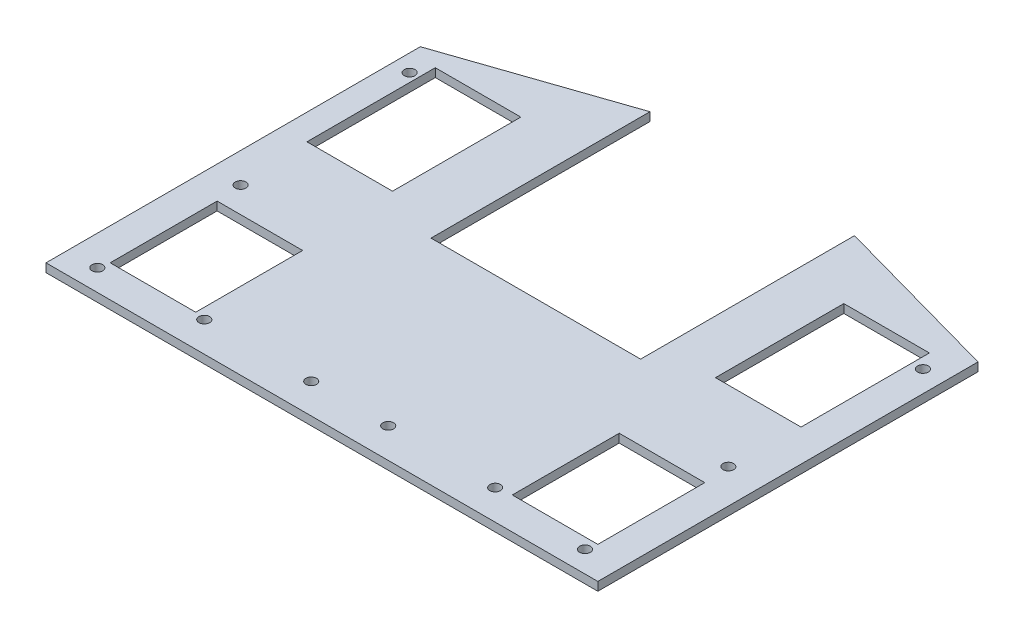
ISO-10303-21;
HEADER;
FILE_DESCRIPTION(('STEP AP214'),'2;1');
FILE_NAME('part.step','',(''),(''),'','','');
FILE_SCHEMA(('AUTOMOTIVE_DESIGN { 1 0 10303 214 1 1 1 1 }'));
ENDSEC;
DATA;
#1=APPLICATION_CONTEXT('core data for automotive mechanical design processes');
#2=APPLICATION_PROTOCOL_DEFINITION('international standard','automotive_design',2000,#1);
#3=PRODUCT_CONTEXT('',#1,'mechanical');
#4=PRODUCT('Part','Part','',(#3));
#5=PRODUCT_RELATED_PRODUCT_CATEGORY('part','',(#4));
#6=PRODUCT_DEFINITION_FORMATION('','',#4);
#7=PRODUCT_DEFINITION_CONTEXT('part definition',#1,'design');
#8=PRODUCT_DEFINITION('design','',#6,#7);
#9=PRODUCT_DEFINITION_SHAPE('','',#8);
#10=(LENGTH_UNIT() NAMED_UNIT(*) SI_UNIT(.MILLI.,.METRE.));
#11=(NAMED_UNIT(*) PLANE_ANGLE_UNIT() SI_UNIT($,.RADIAN.));
#12=(NAMED_UNIT(*) SI_UNIT($,.STERADIAN.) SOLID_ANGLE_UNIT());
#13=UNCERTAINTY_MEASURE_WITH_UNIT(LENGTH_MEASURE(1.E-05),#10,'distance_accuracy_value','');
#14=(GEOMETRIC_REPRESENTATION_CONTEXT(3) GLOBAL_UNCERTAINTY_ASSIGNED_CONTEXT((#13)) GLOBAL_UNIT_ASSIGNED_CONTEXT((#10,
#11,#12)) REPRESENTATION_CONTEXT('',''));
#15=CARTESIAN_POINT('',(0.,0.,0.));
#16=DIRECTION('',(0.,0.,1.));
#17=DIRECTION('',(1.,0.,0.));
#18=AXIS2_PLACEMENT_3D('',#15,#16,#17);
#19=CARTESIAN_POINT('',(0.,4.,0.));
#20=DIRECTION('',(0.,-1.,0.));
#21=DIRECTION('',(0.,0.,-1.));
#22=AXIS2_PLACEMENT_3D('',#19,#20,#21);
#23=PLANE('',#22);
#24=DIRECTION('',(0.,0.,1.));
#25=VECTOR('',#24,1.);
#26=CARTESIAN_POINT('',(-116.,4.,-9.99999999999999));
#27=LINE('',#26,#25);
#28=CARTESIAN_POINT('',(-116.,4.,-70.));
#29=VERTEX_POINT('',#28);
#30=CARTESIAN_POINT('',(-116.,4.,-9.99999999999999));
#31=VERTEX_POINT('',#30);
#32=EDGE_CURVE('E234',#29,#31,#27,.T.);
#33=ORIENTED_EDGE('',*,*,#32,.F.);
#34=DIRECTION('',(-1.,0.,0.));
#35=VECTOR('',#34,1.);
#36=CARTESIAN_POINT('',(-116.,4.,-70.));
#37=LINE('',#36,#35);
#38=CARTESIAN_POINT('',(-76.,4.,-70.));
#39=VERTEX_POINT('',#38);
#40=EDGE_CURVE('E242',#39,#29,#37,.T.);
#41=ORIENTED_EDGE('',*,*,#40,.F.);
#42=DIRECTION('',(0.,0.,-1.));
#43=VECTOR('',#42,1.);
#44=CARTESIAN_POINT('',(-76.,4.,-9.99999999999999));
#45=LINE('',#44,#43);
#46=CARTESIAN_POINT('',(-76.,4.,-9.99999999999999));
#47=VERTEX_POINT('',#46);
#48=EDGE_CURVE('E239',#47,#39,#45,.T.);
#49=ORIENTED_EDGE('',*,*,#48,.F.);
#50=DIRECTION('',(1.,0.,0.));
#51=VECTOR('',#50,1.);
#52=CARTESIAN_POINT('',(-116.,4.,-9.99999999999999));
#53=LINE('',#52,#51);
#54=EDGE_CURVE('E236',#31,#47,#53,.T.);
#55=ORIENTED_EDGE('',*,*,#54,.F.);
#56=EDGE_LOOP('',(#33,#41,#49,#55));
#57=FACE_BOUND('',#56,.T.);
#58=DIRECTION('',(0.,0.,1.));
#59=VECTOR('',#58,1.);
#60=CARTESIAN_POINT('',(75.,4.,85.));
#61=LINE('',#60,#59);
#62=CARTESIAN_POINT('',(75.,4.,35.));
#63=VERTEX_POINT('',#62);
#64=CARTESIAN_POINT('',(75.,4.,85.));
#65=VERTEX_POINT('',#64);
#66=EDGE_CURVE('E296',#63,#65,#61,.T.);
#67=ORIENTED_EDGE('',*,*,#66,.F.);
#68=DIRECTION('',(-1.,0.,0.));
#69=VECTOR('',#68,1.);
#70=CARTESIAN_POINT('',(75.,4.,35.));
#71=LINE('',#70,#69);
#72=CARTESIAN_POINT('',(115.,4.,35.));
#73=VERTEX_POINT('',#72);
#74=EDGE_CURVE('E304',#73,#63,#71,.T.);
#75=ORIENTED_EDGE('',*,*,#74,.F.);
#76=DIRECTION('',(0.,0.,-1.));
#77=VECTOR('',#76,1.);
#78=CARTESIAN_POINT('',(115.,4.,85.));
#79=LINE('',#78,#77);
#80=CARTESIAN_POINT('',(115.,4.,85.));
#81=VERTEX_POINT('',#80);
#82=EDGE_CURVE('E301',#81,#73,#79,.T.);
#83=ORIENTED_EDGE('',*,*,#82,.F.);
#84=DIRECTION('',(1.,0.,0.));
#85=VECTOR('',#84,1.);
#86=CARTESIAN_POINT('',(75.,4.,85.));
#87=LINE('',#86,#85);
#88=EDGE_CURVE('E298',#65,#81,#87,.T.);
#89=ORIENTED_EDGE('',*,*,#88,.F.);
#90=EDGE_LOOP('',(#67,#75,#83,#89));
#91=FACE_BOUND('',#90,.T.);
#92=DIRECTION('',(0.,0.,1.));
#93=VECTOR('',#92,1.);
#94=CARTESIAN_POINT('',(-128.,4.,100.));
#95=LINE('',#94,#93);
#96=CARTESIAN_POINT('',(-128.,4.,-75.));
#97=VERTEX_POINT('',#96);
#98=CARTESIAN_POINT('',(-128.,4.,100.));
#99=VERTEX_POINT('',#98);
#100=EDGE_CURVE('E327',#97,#99,#95,.T.);
#101=ORIENTED_EDGE('',*,*,#100,.T.);
#102=DIRECTION('',(1.,0.,0.));
#103=VECTOR('',#102,1.);
#104=CARTESIAN_POINT('',(-128.,4.,100.));
#105=LINE('',#104,#103);
#106=CARTESIAN_POINT('',(130.,4.,100.));
#107=VERTEX_POINT('',#106);
#108=EDGE_CURVE('E330',#99,#107,#105,.T.);
#109=ORIENTED_EDGE('',*,*,#108,.T.);
#110=DIRECTION('',(0.,0.,-1.));
#111=VECTOR('',#110,1.);
#112=CARTESIAN_POINT('',(130.,4.,100.));
#113=LINE('',#112,#111);
#114=CARTESIAN_POINT('',(130.,4.,-77.7383490664101));
#115=VERTEX_POINT('',#114);
#116=EDGE_CURVE('E333',#107,#115,#113,.T.);
#117=ORIENTED_EDGE('',*,*,#116,.T.);
#118=DIRECTION('',(-0.963395362901552,0.,-0.268084640999418));
#119=VECTOR('',#118,1.);
#120=CARTESIAN_POINT('',(130.,4.,-77.7383490664101));
#121=LINE('',#120,#119);
#122=CARTESIAN_POINT('',(50.,4.,-100.));
#123=VERTEX_POINT('',#122);
#124=EDGE_CURVE('E335',#115,#123,#121,.T.);
#125=ORIENTED_EDGE('',*,*,#124,.T.);
#126=DIRECTION('',(0.,0.,1.));
#127=VECTOR('',#126,1.);
#128=CARTESIAN_POINT('',(50.,4.,0.));
#129=LINE('',#128,#127);
#130=CARTESIAN_POINT('',(50.,4.,0.));
#131=VERTEX_POINT('',#130);
#132=EDGE_CURVE('E337',#123,#131,#129,.T.);
#133=ORIENTED_EDGE('',*,*,#132,.T.);
#134=DIRECTION('',(-1.,0.,0.));
#135=VECTOR('',#134,1.);
#136=CARTESIAN_POINT('',(-48.,4.,0.));
#137=LINE('',#136,#135);
#138=CARTESIAN_POINT('',(-48.,4.,0.));
#139=VERTEX_POINT('',#138);
#140=EDGE_CURVE('E339',#131,#139,#137,.T.);
#141=ORIENTED_EDGE('',*,*,#140,.T.);
#142=DIRECTION('',(0.,0.,-1.));
#143=VECTOR('',#142,1.);
#144=CARTESIAN_POINT('',(-48.,4.,-102.368421052632));
#145=LINE('',#144,#143);
#146=CARTESIAN_POINT('',(-48.,4.,-102.368421052632));
#147=VERTEX_POINT('',#146);
#148=EDGE_CURVE('E341',#139,#147,#145,.T.);
#149=ORIENTED_EDGE('',*,*,#148,.T.);
#150=DIRECTION('',(-0.946163984953356,0.,0.32368767906299));
#151=VECTOR('',#150,1.);
#152=CARTESIAN_POINT('',(-128.,4.,-75.));
#153=LINE('',#152,#151);
#154=EDGE_CURVE('E343',#147,#97,#153,.T.);
#155=ORIENTED_EDGE('',*,*,#154,.T.);
#156=EDGE_LOOP('',(#101,#109,#117,#125,#133,#141,#149,#155));
#157=FACE_BOUND('',#156,.T.);
#158=DIRECTION('',(0.,0.,1.));
#159=VECTOR('',#158,1.);
#160=CARTESIAN_POINT('',(75.,4.,-9.99999999999999));
#161=LINE('',#160,#159);
#162=CARTESIAN_POINT('',(75.,4.,-70.));
#163=VERTEX_POINT('',#162);
#164=CARTESIAN_POINT('',(75.,4.,-9.99999999999999));
#165=VERTEX_POINT('',#164);
#166=EDGE_CURVE('E265',#163,#165,#161,.T.);
#167=ORIENTED_EDGE('',*,*,#166,.F.);
#168=DIRECTION('',(-1.,0.,0.));
#169=VECTOR('',#168,1.);
#170=CARTESIAN_POINT('',(75.,4.,-70.));
#171=LINE('',#170,#169);
#172=CARTESIAN_POINT('',(115.,4.,-70.));
#173=VERTEX_POINT('',#172);
#174=EDGE_CURVE('E273',#173,#163,#171,.T.);
#175=ORIENTED_EDGE('',*,*,#174,.F.);
#176=DIRECTION('',(0.,0.,-1.));
#177=VECTOR('',#176,1.);
#178=CARTESIAN_POINT('',(115.,4.,-9.99999999999999));
#179=LINE('',#178,#177);
#180=CARTESIAN_POINT('',(115.,4.,-9.99999999999999));
#181=VERTEX_POINT('',#180);
#182=EDGE_CURVE('E270',#181,#173,#179,.T.);
#183=ORIENTED_EDGE('',*,*,#182,.F.);
#184=DIRECTION('',(1.,0.,0.));
#185=VECTOR('',#184,1.);
#186=CARTESIAN_POINT('',(75.,4.,-9.99999999999999));
#187=LINE('',#186,#185);
#188=EDGE_CURVE('E267',#165,#181,#187,.T.);
#189=ORIENTED_EDGE('',*,*,#188,.F.);
#190=EDGE_LOOP('',(#167,#175,#183,#189));
#191=FACE_BOUND('',#190,.T.);
#192=DIRECTION('',(0.,0.,1.));
#193=VECTOR('',#192,1.);
#194=CARTESIAN_POINT('',(-113.,4.,85.));
#195=LINE('',#194,#193);
#196=CARTESIAN_POINT('',(-113.,4.,35.));
#197=VERTEX_POINT('',#196);
#198=CARTESIAN_POINT('',(-113.,4.,85.));
#199=VERTEX_POINT('',#198);
#200=EDGE_CURVE('E195',#197,#199,#195,.T.);
#201=ORIENTED_EDGE('',*,*,#200,.F.);
#202=DIRECTION('',(-1.,0.,0.));
#203=VECTOR('',#202,1.);
#204=CARTESIAN_POINT('',(-113.,4.,35.));
#205=LINE('',#204,#203);
#206=CARTESIAN_POINT('',(-73.,4.,35.));
#207=VERTEX_POINT('',#206);
#208=EDGE_CURVE('E218',#207,#197,#205,.T.);
#209=ORIENTED_EDGE('',*,*,#208,.F.);
#210=DIRECTION('',(0.,0.,-1.));
#211=VECTOR('',#210,1.);
#212=CARTESIAN_POINT('',(-73.,4.,85.));
#213=LINE('',#212,#211);
#214=CARTESIAN_POINT('',(-73.,4.,85.));
#215=VERTEX_POINT('',#214);
#216=EDGE_CURVE('E216',#215,#207,#213,.T.);
#217=ORIENTED_EDGE('',*,*,#216,.F.);
#218=DIRECTION('',(1.,0.,0.));
#219=VECTOR('',#218,1.);
#220=CARTESIAN_POINT('',(-113.,4.,85.));
#221=LINE('',#220,#219);
#222=EDGE_CURVE('E203',#199,#215,#221,.T.);
#223=ORIENTED_EDGE('',*,*,#222,.F.);
#224=EDGE_LOOP('',(#201,#209,#217,#223));
#225=FACE_BOUND('',#224,.T.);
#226=CARTESIAN_POINT('',(-114.,4.,90.));
#227=DIRECTION('',(0.,1.,0.));
#228=DIRECTION('',(0.,0.,1.));
#229=AXIS2_PLACEMENT_3D('',#226,#227,#228);
#230=CIRCLE('',#229,2.50000000000001);
#231=CARTESIAN_POINT('',(-114.,4.,92.5));
#232=VERTEX_POINT('',#231);
#233=EDGE_CURVE('E224',#232,#232,#230,.T.);
#234=ORIENTED_EDGE('',*,*,#233,.F.);
#235=EDGE_LOOP('',(#234));
#236=FACE_BOUND('',#235,.T.);
#237=CARTESIAN_POINT('',(-68.,4.,86.));
#238=DIRECTION('',(0.,1.,0.));
#239=DIRECTION('',(0.,0.,1.));
#240=AXIS2_PLACEMENT_3D('',#237,#238,#239);
#241=CIRCLE('',#240,2.5);
#242=CARTESIAN_POINT('',(-68.,4.,88.5));
#243=VERTEX_POINT('',#242);
#244=EDGE_CURVE('E611',#243,#243,#241,.T.);
#245=ORIENTED_EDGE('',*,*,#244,.F.);
#246=EDGE_LOOP('',(#245));
#247=FACE_BOUND('',#246,.T.);
#248=CARTESIAN_POINT('',(-18.,4.,86.));
#249=DIRECTION('',(0.,1.,0.));
#250=DIRECTION('',(0.,0.,1.));
#251=AXIS2_PLACEMENT_3D('',#248,#249,#250);
#252=CIRCLE('',#251,2.5);
#253=CARTESIAN_POINT('',(-18.,4.,88.5));
#254=VERTEX_POINT('',#253);
#255=EDGE_CURVE('E605',#254,#254,#252,.T.);
#256=ORIENTED_EDGE('',*,*,#255,.F.);
#257=EDGE_LOOP('',(#256));
#258=FACE_BOUND('',#257,.T.);
#259=CARTESIAN_POINT('',(-120.,4.,-62.));
#260=DIRECTION('',(0.,1.,0.));
#261=DIRECTION('',(0.,0.,1.));
#262=AXIS2_PLACEMENT_3D('',#259,#260,#261);
#263=CIRCLE('',#262,2.5);
#264=CARTESIAN_POINT('',(-120.,4.,-59.5));
#265=VERTEX_POINT('',#264);
#266=EDGE_CURVE('E599',#265,#265,#263,.T.);
#267=ORIENTED_EDGE('',*,*,#266,.F.);
#268=EDGE_LOOP('',(#267));
#269=FACE_BOUND('',#268,.T.);
#270=CARTESIAN_POINT('',(-114.,4.,23.));
#271=DIRECTION('',(0.,1.,0.));
#272=DIRECTION('',(0.,0.,1.));
#273=AXIS2_PLACEMENT_3D('',#270,#271,#272);
#274=CIRCLE('',#273,2.50000000000001);
#275=CARTESIAN_POINT('',(-114.,4.,25.5));
#276=VERTEX_POINT('',#275);
#277=EDGE_CURVE('E593',#276,#276,#274,.T.);
#278=ORIENTED_EDGE('',*,*,#277,.F.);
#279=EDGE_LOOP('',(#278));
#280=FACE_BOUND('',#279,.T.);
#281=CARTESIAN_POINT('',(18.,4.,86.));
#282=DIRECTION('',(0.,1.,0.));
#283=DIRECTION('',(0.,0.,-1.));
#284=AXIS2_PLACEMENT_3D('',#281,#282,#283);
#285=CIRCLE('',#284,2.5);
#286=CARTESIAN_POINT('',(18.,4.,83.5));
#287=VERTEX_POINT('',#286);
#288=EDGE_CURVE('E587',#287,#287,#285,.T.);
#289=ORIENTED_EDGE('',*,*,#288,.F.);
#290=EDGE_LOOP('',(#289));
#291=FACE_BOUND('',#290,.T.);
#292=CARTESIAN_POINT('',(68.,4.,86.));
#293=DIRECTION('',(0.,1.,0.));
#294=DIRECTION('',(0.,0.,-1.));
#295=AXIS2_PLACEMENT_3D('',#292,#293,#294);
#296=CIRCLE('',#295,2.5);
#297=CARTESIAN_POINT('',(68.,4.,83.5));
#298=VERTEX_POINT('',#297);
#299=EDGE_CURVE('E581',#298,#298,#296,.T.);
#300=ORIENTED_EDGE('',*,*,#299,.F.);
#301=EDGE_LOOP('',(#300));
#302=FACE_BOUND('',#301,.T.);
#303=CARTESIAN_POINT('',(114.,4.,90.));
#304=DIRECTION('',(0.,1.,0.));
#305=DIRECTION('',(0.,0.,-1.));
#306=AXIS2_PLACEMENT_3D('',#303,#304,#305);
#307=CIRCLE('',#306,2.50000000000001);
#308=CARTESIAN_POINT('',(114.,4.,87.5));
#309=VERTEX_POINT('',#308);
#310=EDGE_CURVE('E575',#309,#309,#307,.T.);
#311=ORIENTED_EDGE('',*,*,#310,.F.);
#312=EDGE_LOOP('',(#311));
#313=FACE_BOUND('',#312,.T.);
#314=CARTESIAN_POINT('',(114.,4.,23.));
#315=DIRECTION('',(0.,1.,0.));
#316=DIRECTION('',(0.,0.,-1.));
#317=AXIS2_PLACEMENT_3D('',#314,#315,#316);
#318=CIRCLE('',#317,2.50000000000001);
#319=CARTESIAN_POINT('',(114.,4.,20.5));
#320=VERTEX_POINT('',#319);
#321=EDGE_CURVE('E569',#320,#320,#318,.T.);
#322=ORIENTED_EDGE('',*,*,#321,.F.);
#323=EDGE_LOOP('',(#322));
#324=FACE_BOUND('',#323,.T.);
#325=CARTESIAN_POINT('',(120.,4.,-62.));
#326=DIRECTION('',(0.,1.,0.));
#327=DIRECTION('',(0.,0.,-1.));
#328=AXIS2_PLACEMENT_3D('',#325,#326,#327);
#329=CIRCLE('',#328,2.5);
#330=CARTESIAN_POINT('',(120.,4.,-64.5));
#331=VERTEX_POINT('',#330);
#332=EDGE_CURVE('E560',#331,#331,#329,.T.);
#333=ORIENTED_EDGE('',*,*,#332,.F.);
#334=EDGE_LOOP('',(#333));
#335=FACE_BOUND('',#334,.T.);
#336=ADVANCED_FACE('F34',(#57,#91,#157,#191,#225,#236,#247,#258,#269,#280,#291,#302,#313,#324,
#335),#23,.F.);
#337=CARTESIAN_POINT('',(0.,0.,0.));
#338=DIRECTION('',(0.,-1.,0.));
#339=DIRECTION('',(0.,0.,-1.));
#340=AXIS2_PLACEMENT_3D('',#337,#338,#339);
#341=PLANE('',#340);
#342=CARTESIAN_POINT('',(114.,0.,23.));
#343=DIRECTION('',(0.,1.,0.));
#344=DIRECTION('',(0.,0.,-1.));
#345=AXIS2_PLACEMENT_3D('',#342,#343,#344);
#346=CIRCLE('',#345,2.50000000000001);
#347=CARTESIAN_POINT('',(114.,0.,20.5));
#348=VERTEX_POINT('',#347);
#349=EDGE_CURVE('E566',#348,#348,#346,.T.);
#350=ORIENTED_EDGE('',*,*,#349,.T.);
#351=EDGE_LOOP('',(#350));
#352=FACE_BOUND('',#351,.T.);
#353=CARTESIAN_POINT('',(68.,0.,86.));
#354=DIRECTION('',(0.,1.,0.));
#355=DIRECTION('',(0.,0.,-1.));
#356=AXIS2_PLACEMENT_3D('',#353,#354,#355);
#357=CIRCLE('',#356,2.5);
#358=CARTESIAN_POINT('',(68.,0.,83.5));
#359=VERTEX_POINT('',#358);
#360=EDGE_CURVE('E578',#359,#359,#357,.T.);
#361=ORIENTED_EDGE('',*,*,#360,.T.);
#362=EDGE_LOOP('',(#361));
#363=FACE_BOUND('',#362,.T.);
#364=CARTESIAN_POINT('',(-114.,0.,23.));
#365=DIRECTION('',(0.,1.,0.));
#366=DIRECTION('',(0.,0.,1.));
#367=AXIS2_PLACEMENT_3D('',#364,#365,#366);
#368=CIRCLE('',#367,2.50000000000001);
#369=CARTESIAN_POINT('',(-114.,0.,25.5));
#370=VERTEX_POINT('',#369);
#371=EDGE_CURVE('E590',#370,#370,#368,.T.);
#372=ORIENTED_EDGE('',*,*,#371,.T.);
#373=EDGE_LOOP('',(#372));
#374=FACE_BOUND('',#373,.T.);
#375=CARTESIAN_POINT('',(-18.,0.,86.));
#376=DIRECTION('',(0.,1.,0.));
#377=DIRECTION('',(0.,0.,1.));
#378=AXIS2_PLACEMENT_3D('',#375,#376,#377);
#379=CIRCLE('',#378,2.5);
#380=CARTESIAN_POINT('',(-18.,0.,88.5));
#381=VERTEX_POINT('',#380);
#382=EDGE_CURVE('E602',#381,#381,#379,.T.);
#383=ORIENTED_EDGE('',*,*,#382,.T.);
#384=EDGE_LOOP('',(#383));
#385=FACE_BOUND('',#384,.T.);
#386=CARTESIAN_POINT('',(-114.,0.,90.));
#387=DIRECTION('',(0.,1.,0.));
#388=DIRECTION('',(0.,0.,1.));
#389=AXIS2_PLACEMENT_3D('',#386,#387,#388);
#390=CIRCLE('',#389,2.50000000000001);
#391=CARTESIAN_POINT('',(-114.,0.,92.5));
#392=VERTEX_POINT('',#391);
#393=EDGE_CURVE('E614',#392,#392,#390,.T.);
#394=ORIENTED_EDGE('',*,*,#393,.T.);
#395=EDGE_LOOP('',(#394));
#396=FACE_BOUND('',#395,.T.);
#397=DIRECTION('',(0.,0.,1.));
#398=VECTOR('',#397,1.);
#399=CARTESIAN_POINT('',(-128.,0.,100.));
#400=LINE('',#399,#398);
#401=CARTESIAN_POINT('',(-128.,0.,-75.));
#402=VERTEX_POINT('',#401);
#403=CARTESIAN_POINT('',(-128.,0.,100.));
#404=VERTEX_POINT('',#403);
#405=EDGE_CURVE('E326',#402,#404,#400,.T.);
#406=ORIENTED_EDGE('',*,*,#405,.F.);
#407=DIRECTION('',(-0.946163984953356,0.,0.32368767906299));
#408=VECTOR('',#407,1.);
#409=CARTESIAN_POINT('',(-128.,0.,-75.));
#410=LINE('',#409,#408);
#411=CARTESIAN_POINT('',(-48.,0.,-102.368421052632));
#412=VERTEX_POINT('',#411);
#413=EDGE_CURVE('E331',#412,#402,#410,.T.);
#414=ORIENTED_EDGE('',*,*,#413,.F.);
#415=DIRECTION('',(0.,0.,-1.));
#416=VECTOR('',#415,1.);
#417=CARTESIAN_POINT('',(-48.,0.,-102.368421052632));
#418=LINE('',#417,#416);
#419=CARTESIAN_POINT('',(-48.,0.,0.));
#420=VERTEX_POINT('',#419);
#421=EDGE_CURVE('E358',#420,#412,#418,.T.);
#422=ORIENTED_EDGE('',*,*,#421,.F.);
#423=DIRECTION('',(-1.,0.,0.));
#424=VECTOR('',#423,1.);
#425=CARTESIAN_POINT('',(-48.,0.,0.));
#426=LINE('',#425,#424);
#427=CARTESIAN_POINT('',(50.,0.,0.));
#428=VERTEX_POINT('',#427);
#429=EDGE_CURVE('E356',#428,#420,#426,.T.);
#430=ORIENTED_EDGE('',*,*,#429,.F.);
#431=DIRECTION('',(0.,0.,1.));
#432=VECTOR('',#431,1.);
#433=CARTESIAN_POINT('',(50.,0.,0.));
#434=LINE('',#433,#432);
#435=CARTESIAN_POINT('',(50.,0.,-100.));
#436=VERTEX_POINT('',#435);
#437=EDGE_CURVE('E354',#436,#428,#434,.T.);
#438=ORIENTED_EDGE('',*,*,#437,.F.);
#439=DIRECTION('',(-0.963395362901552,0.,-0.268084640999418));
#440=VECTOR('',#439,1.);
#441=CARTESIAN_POINT('',(130.,0.,-77.7383490664101));
#442=LINE('',#441,#440);
#443=CARTESIAN_POINT('',(130.,0.,-77.7383490664101));
#444=VERTEX_POINT('',#443);
#445=EDGE_CURVE('E352',#444,#436,#442,.T.);
#446=ORIENTED_EDGE('',*,*,#445,.F.);
#447=DIRECTION('',(0.,0.,-1.));
#448=VECTOR('',#447,1.);
#449=CARTESIAN_POINT('',(130.,0.,100.));
#450=LINE('',#449,#448);
#451=CARTESIAN_POINT('',(130.,0.,100.));
#452=VERTEX_POINT('',#451);
#453=EDGE_CURVE('E350',#452,#444,#450,.T.);
#454=ORIENTED_EDGE('',*,*,#453,.F.);
#455=DIRECTION('',(1.,0.,0.));
#456=VECTOR('',#455,1.);
#457=CARTESIAN_POINT('',(-128.,0.,100.));
#458=LINE('',#457,#456);
#459=EDGE_CURVE('E348',#404,#452,#458,.T.);
#460=ORIENTED_EDGE('',*,*,#459,.F.);
#461=EDGE_LOOP('',(#406,#414,#422,#430,#438,#446,#454,#460));
#462=FACE_BOUND('',#461,.T.);
#463=DIRECTION('',(-1.,0.,0.));
#464=VECTOR('',#463,1.);
#465=CARTESIAN_POINT('',(75.,0.,35.));
#466=LINE('',#465,#464);
#467=CARTESIAN_POINT('',(115.,0.,35.));
#468=VERTEX_POINT('',#467);
#469=CARTESIAN_POINT('',(75.,0.,35.));
#470=VERTEX_POINT('',#469);
#471=EDGE_CURVE('E299',#468,#470,#466,.T.);
#472=ORIENTED_EDGE('',*,*,#471,.T.);
#473=DIRECTION('',(0.,0.,1.));
#474=VECTOR('',#473,1.);
#475=CARTESIAN_POINT('',(75.,0.,85.));
#476=LINE('',#475,#474);
#477=CARTESIAN_POINT('',(75.,0.,85.));
#478=VERTEX_POINT('',#477);
#479=EDGE_CURVE('E295',#470,#478,#476,.T.);
#480=ORIENTED_EDGE('',*,*,#479,.T.);
#481=DIRECTION('',(1.,0.,0.));
#482=VECTOR('',#481,1.);
#483=CARTESIAN_POINT('',(75.,0.,85.));
#484=LINE('',#483,#482);
#485=CARTESIAN_POINT('',(115.,0.,85.));
#486=VERTEX_POINT('',#485);
#487=EDGE_CURVE('E309',#478,#486,#484,.T.);
#488=ORIENTED_EDGE('',*,*,#487,.T.);
#489=DIRECTION('',(0.,0.,-1.));
#490=VECTOR('',#489,1.);
#491=CARTESIAN_POINT('',(115.,0.,85.));
#492=LINE('',#491,#490);
#493=EDGE_CURVE('E312',#486,#468,#492,.T.);
#494=ORIENTED_EDGE('',*,*,#493,.T.);
#495=EDGE_LOOP('',(#472,#480,#488,#494));
#496=FACE_BOUND('',#495,.T.);
#497=DIRECTION('',(-1.,0.,0.));
#498=VECTOR('',#497,1.);
#499=CARTESIAN_POINT('',(75.,0.,-70.));
#500=LINE('',#499,#498);
#501=CARTESIAN_POINT('',(115.,0.,-70.));
#502=VERTEX_POINT('',#501);
#503=CARTESIAN_POINT('',(75.,0.,-70.));
#504=VERTEX_POINT('',#503);
#505=EDGE_CURVE('E268',#502,#504,#500,.T.);
#506=ORIENTED_EDGE('',*,*,#505,.T.);
#507=DIRECTION('',(0.,0.,1.));
#508=VECTOR('',#507,1.);
#509=CARTESIAN_POINT('',(75.,0.,-9.99999999999999));
#510=LINE('',#509,#508);
#511=CARTESIAN_POINT('',(75.,0.,-9.99999999999999));
#512=VERTEX_POINT('',#511);
#513=EDGE_CURVE('E264',#504,#512,#510,.T.);
#514=ORIENTED_EDGE('',*,*,#513,.T.);
#515=DIRECTION('',(1.,0.,0.));
#516=VECTOR('',#515,1.);
#517=CARTESIAN_POINT('',(75.,0.,-9.99999999999999));
#518=LINE('',#517,#516);
#519=CARTESIAN_POINT('',(115.,0.,-9.99999999999999));
#520=VERTEX_POINT('',#519);
#521=EDGE_CURVE('E278',#512,#520,#518,.T.);
#522=ORIENTED_EDGE('',*,*,#521,.T.);
#523=DIRECTION('',(0.,0.,-1.));
#524=VECTOR('',#523,1.);
#525=CARTESIAN_POINT('',(115.,0.,-9.99999999999999));
#526=LINE('',#525,#524);
#527=EDGE_CURVE('E281',#520,#502,#526,.T.);
#528=ORIENTED_EDGE('',*,*,#527,.T.);
#529=EDGE_LOOP('',(#506,#514,#522,#528));
#530=FACE_BOUND('',#529,.T.);
#531=DIRECTION('',(-1.,0.,0.));
#532=VECTOR('',#531,1.);
#533=CARTESIAN_POINT('',(-116.,0.,-70.));
#534=LINE('',#533,#532);
#535=CARTESIAN_POINT('',(-76.,0.,-70.));
#536=VERTEX_POINT('',#535);
#537=CARTESIAN_POINT('',(-116.,0.,-70.));
#538=VERTEX_POINT('',#537);
#539=EDGE_CURVE('E237',#536,#538,#534,.T.);
#540=ORIENTED_EDGE('',*,*,#539,.T.);
#541=DIRECTION('',(0.,0.,1.));
#542=VECTOR('',#541,1.);
#543=CARTESIAN_POINT('',(-116.,0.,-9.99999999999999));
#544=LINE('',#543,#542);
#545=CARTESIAN_POINT('',(-116.,0.,-9.99999999999999));
#546=VERTEX_POINT('',#545);
#547=EDGE_CURVE('E211',#538,#546,#544,.T.);
#548=ORIENTED_EDGE('',*,*,#547,.T.);
#549=DIRECTION('',(1.,0.,0.));
#550=VECTOR('',#549,1.);
#551=CARTESIAN_POINT('',(-116.,0.,-9.99999999999999));
#552=LINE('',#551,#550);
#553=CARTESIAN_POINT('',(-76.,0.,-9.99999999999999));
#554=VERTEX_POINT('',#553);
#555=EDGE_CURVE('E247',#546,#554,#552,.T.);
#556=ORIENTED_EDGE('',*,*,#555,.T.);
#557=DIRECTION('',(0.,0.,-1.));
#558=VECTOR('',#557,1.);
#559=CARTESIAN_POINT('',(-76.,0.,-9.99999999999999));
#560=LINE('',#559,#558);
#561=EDGE_CURVE('E250',#554,#536,#560,.T.);
#562=ORIENTED_EDGE('',*,*,#561,.T.);
#563=EDGE_LOOP('',(#540,#548,#556,#562));
#564=FACE_BOUND('',#563,.T.);
#565=DIRECTION('',(-1.,0.,0.));
#566=VECTOR('',#565,1.);
#567=CARTESIAN_POINT('',(-113.,0.,35.));
#568=LINE('',#567,#566);
#569=CARTESIAN_POINT('',(-73.,0.,35.));
#570=VERTEX_POINT('',#569);
#571=CARTESIAN_POINT('',(-113.,0.,35.));
#572=VERTEX_POINT('',#571);
#573=EDGE_CURVE('E204',#570,#572,#568,.T.);
#574=ORIENTED_EDGE('',*,*,#573,.T.);
#575=DIRECTION('',(0.,0.,1.));
#576=VECTOR('',#575,1.);
#577=CARTESIAN_POINT('',(-113.,0.,85.));
#578=LINE('',#577,#576);
#579=CARTESIAN_POINT('',(-113.,0.,85.));
#580=VERTEX_POINT('',#579);
#581=EDGE_CURVE('E57',#572,#580,#578,.T.);
#582=ORIENTED_EDGE('',*,*,#581,.T.);
#583=DIRECTION('',(1.,0.,0.));
#584=VECTOR('',#583,1.);
#585=CARTESIAN_POINT('',(-113.,0.,85.));
#586=LINE('',#585,#584);
#587=CARTESIAN_POINT('',(-73.,0.,85.));
#588=VERTEX_POINT('',#587);
#589=EDGE_CURVE('E210',#580,#588,#586,.T.);
#590=ORIENTED_EDGE('',*,*,#589,.T.);
#591=DIRECTION('',(0.,0.,-1.));
#592=VECTOR('',#591,1.);
#593=CARTESIAN_POINT('',(-73.,0.,85.));
#594=LINE('',#593,#592);
#595=EDGE_CURVE('E226',#588,#570,#594,.T.);
#596=ORIENTED_EDGE('',*,*,#595,.T.);
#597=EDGE_LOOP('',(#574,#582,#590,#596));
#598=FACE_BOUND('',#597,.T.);
#599=CARTESIAN_POINT('',(-68.,0.,86.));
#600=DIRECTION('',(0.,1.,0.));
#601=DIRECTION('',(0.,0.,1.));
#602=AXIS2_PLACEMENT_3D('',#599,#600,#601);
#603=CIRCLE('',#602,2.5);
#604=CARTESIAN_POINT('',(-68.,0.,88.5));
#605=VERTEX_POINT('',#604);
#606=EDGE_CURVE('E608',#605,#605,#603,.T.);
#607=ORIENTED_EDGE('',*,*,#606,.T.);
#608=EDGE_LOOP('',(#607));
#609=FACE_BOUND('',#608,.T.);
#610=CARTESIAN_POINT('',(-120.,0.,-62.));
#611=DIRECTION('',(0.,1.,0.));
#612=DIRECTION('',(0.,0.,1.));
#613=AXIS2_PLACEMENT_3D('',#610,#611,#612);
#614=CIRCLE('',#613,2.5);
#615=CARTESIAN_POINT('',(-120.,0.,-59.5));
#616=VERTEX_POINT('',#615);
#617=EDGE_CURVE('E596',#616,#616,#614,.T.);
#618=ORIENTED_EDGE('',*,*,#617,.T.);
#619=EDGE_LOOP('',(#618));
#620=FACE_BOUND('',#619,.T.);
#621=CARTESIAN_POINT('',(18.,0.,86.));
#622=DIRECTION('',(0.,1.,0.));
#623=DIRECTION('',(0.,0.,-1.));
#624=AXIS2_PLACEMENT_3D('',#621,#622,#623);
#625=CIRCLE('',#624,2.5);
#626=CARTESIAN_POINT('',(18.,0.,83.5));
#627=VERTEX_POINT('',#626);
#628=EDGE_CURVE('E584',#627,#627,#625,.T.);
#629=ORIENTED_EDGE('',*,*,#628,.T.);
#630=EDGE_LOOP('',(#629));
#631=FACE_BOUND('',#630,.T.);
#632=CARTESIAN_POINT('',(114.,0.,90.));
#633=DIRECTION('',(0.,1.,0.));
#634=DIRECTION('',(0.,0.,-1.));
#635=AXIS2_PLACEMENT_3D('',#632,#633,#634);
#636=CIRCLE('',#635,2.50000000000001);
#637=CARTESIAN_POINT('',(114.,0.,87.5));
#638=VERTEX_POINT('',#637);
#639=EDGE_CURVE('E572',#638,#638,#636,.T.);
#640=ORIENTED_EDGE('',*,*,#639,.T.);
#641=EDGE_LOOP('',(#640));
#642=FACE_BOUND('',#641,.T.);
#643=CARTESIAN_POINT('',(120.,0.,-62.));
#644=DIRECTION('',(0.,1.,0.));
#645=DIRECTION('',(0.,0.,-1.));
#646=AXIS2_PLACEMENT_3D('',#643,#644,#645);
#647=CIRCLE('',#646,2.5);
#648=CARTESIAN_POINT('',(120.,0.,-64.5));
#649=VERTEX_POINT('',#648);
#650=EDGE_CURVE('E563',#649,#649,#647,.T.);
#651=ORIENTED_EDGE('',*,*,#650,.T.);
#652=EDGE_LOOP('',(#651));
#653=FACE_BOUND('',#652,.T.);
#654=ADVANCED_FACE('F388',(#352,#363,#374,#385,#396,#462,#496,#530,#564,#598,#609,#620,#631,
#642,#653),#341,.T.);
#655=CARTESIAN_POINT('',(-128.,4.,100.));
#656=DIRECTION('',(1.,0.,0.));
#657=DIRECTION('',(0.,0.,-1.));
#658=AXIS2_PLACEMENT_3D('',#655,#656,#657);
#659=PLANE('',#658);
#660=ORIENTED_EDGE('',*,*,#405,.T.);
#661=DIRECTION('',(0.,-1.,0.));
#662=VECTOR('',#661,1.);
#663=CARTESIAN_POINT('',(-128.,4.,100.));
#664=LINE('',#663,#662);
#665=EDGE_CURVE('E11',#99,#404,#664,.T.);
#666=ORIENTED_EDGE('',*,*,#665,.F.);
#667=ORIENTED_EDGE('',*,*,#100,.F.);
#668=DIRECTION('',(0.,-1.,0.));
#669=VECTOR('',#668,1.);
#670=CARTESIAN_POINT('',(-128.,4.,-75.));
#671=LINE('',#670,#669);
#672=EDGE_CURVE('E345',#97,#402,#671,.T.);
#673=ORIENTED_EDGE('',*,*,#672,.T.);
#674=EDGE_LOOP('',(#660,#666,#667,#673));
#675=FACE_BOUND('',#674,.T.);
#676=ADVANCED_FACE('F36',(#675),#659,.F.);
#677=CARTESIAN_POINT('',(-128.,4.,100.));
#678=DIRECTION('',(0.,0.,-1.));
#679=DIRECTION('',(-1.,0.,0.));
#680=AXIS2_PLACEMENT_3D('',#677,#678,#679);
#681=PLANE('',#680);
#682=ORIENTED_EDGE('',*,*,#459,.T.);
#683=DIRECTION('',(0.,-1.,0.));
#684=VECTOR('',#683,1.);
#685=CARTESIAN_POINT('',(130.,4.,100.));
#686=LINE('',#685,#684);
#687=EDGE_CURVE('E42',#107,#452,#686,.T.);
#688=ORIENTED_EDGE('',*,*,#687,.F.);
#689=ORIENTED_EDGE('',*,*,#108,.F.);
#690=ORIENTED_EDGE('',*,*,#665,.T.);
#691=EDGE_LOOP('',(#682,#688,#689,#690));
#692=FACE_BOUND('',#691,.T.);
#693=ADVANCED_FACE('F406',(#692),#681,.F.);
#694=CARTESIAN_POINT('',(130.,4.,100.));
#695=DIRECTION('',(-1.,0.,0.));
#696=DIRECTION('',(0.,0.,1.));
#697=AXIS2_PLACEMENT_3D('',#694,#695,#696);
#698=PLANE('',#697);
#699=ORIENTED_EDGE('',*,*,#453,.T.);
#700=DIRECTION('',(0.,-1.,0.));
#701=VECTOR('',#700,1.);
#702=CARTESIAN_POINT('',(130.,4.,-77.7383490664101));
#703=LINE('',#702,#701);
#704=EDGE_CURVE('E375',#115,#444,#703,.T.);
#705=ORIENTED_EDGE('',*,*,#704,.F.);
#706=ORIENTED_EDGE('',*,*,#116,.F.);
#707=ORIENTED_EDGE('',*,*,#687,.T.);
#708=EDGE_LOOP('',(#699,#705,#706,#707));
#709=FACE_BOUND('',#708,.T.);
#710=ADVANCED_FACE('F382',(#709),#698,.F.);
#711=CARTESIAN_POINT('',(130.,4.,-77.7383490664101));
#712=DIRECTION('',(-0.268084640999419,0.,0.963395362901552));
#713=DIRECTION('',(0.963395362901552,0.,0.268084640999419));
#714=AXIS2_PLACEMENT_3D('',#711,#712,#713);
#715=PLANE('',#714);
#716=ORIENTED_EDGE('',*,*,#445,.T.);
#717=DIRECTION('',(0.,-1.,0.));
#718=VECTOR('',#717,1.);
#719=CARTESIAN_POINT('',(50.,4.,-100.));
#720=LINE('',#719,#718);
#721=EDGE_CURVE('E372',#123,#436,#720,.T.);
#722=ORIENTED_EDGE('',*,*,#721,.F.);
#723=ORIENTED_EDGE('',*,*,#124,.F.);
#724=ORIENTED_EDGE('',*,*,#704,.T.);
#725=EDGE_LOOP('',(#716,#722,#723,#724));
#726=FACE_BOUND('',#725,.T.);
#727=ADVANCED_FACE('F394',(#726),#715,.F.);
#728=CARTESIAN_POINT('',(50.,4.,0.));
#729=DIRECTION('',(1.,0.,0.));
#730=DIRECTION('',(0.,0.,-1.));
#731=AXIS2_PLACEMENT_3D('',#728,#729,#730);
#732=PLANE('',#731);
#733=ORIENTED_EDGE('',*,*,#437,.T.);
#734=DIRECTION('',(0.,-1.,0.));
#735=VECTOR('',#734,1.);
#736=CARTESIAN_POINT('',(50.,4.,0.));
#737=LINE('',#736,#735);
#738=EDGE_CURVE('E369',#131,#428,#737,.T.);
#739=ORIENTED_EDGE('',*,*,#738,.F.);
#740=ORIENTED_EDGE('',*,*,#132,.F.);
#741=ORIENTED_EDGE('',*,*,#721,.T.);
#742=EDGE_LOOP('',(#733,#739,#740,#741));
#743=FACE_BOUND('',#742,.T.);
#744=ADVANCED_FACE('F398',(#743),#732,.F.);
#745=CARTESIAN_POINT('',(-48.,4.,0.));
#746=DIRECTION('',(0.,0.,1.));
#747=DIRECTION('',(1.,0.,0.));
#748=AXIS2_PLACEMENT_3D('',#745,#746,#747);
#749=PLANE('',#748);
#750=ORIENTED_EDGE('',*,*,#429,.T.);
#751=DIRECTION('',(0.,-1.,0.));
#752=VECTOR('',#751,1.);
#753=CARTESIAN_POINT('',(-48.,4.,0.));
#754=LINE('',#753,#752);
#755=EDGE_CURVE('E366',#139,#420,#754,.T.);
#756=ORIENTED_EDGE('',*,*,#755,.F.);
#757=ORIENTED_EDGE('',*,*,#140,.F.);
#758=ORIENTED_EDGE('',*,*,#738,.T.);
#759=EDGE_LOOP('',(#750,#756,#757,#758));
#760=FACE_BOUND('',#759,.T.);
#761=ADVANCED_FACE('F419',(#760),#749,.F.);
#762=CARTESIAN_POINT('',(-48.,4.,-102.368421052632));
#763=DIRECTION('',(-1.,0.,0.));
#764=DIRECTION('',(0.,0.,1.));
#765=AXIS2_PLACEMENT_3D('',#762,#763,#764);
#766=PLANE('',#765);
#767=ORIENTED_EDGE('',*,*,#421,.T.);
#768=DIRECTION('',(0.,-1.,0.));
#769=VECTOR('',#768,1.);
#770=CARTESIAN_POINT('',(-48.,4.,-102.368421052632));
#771=LINE('',#770,#769);
#772=EDGE_CURVE('E363',#147,#412,#771,.T.);
#773=ORIENTED_EDGE('',*,*,#772,.F.);
#774=ORIENTED_EDGE('',*,*,#148,.F.);
#775=ORIENTED_EDGE('',*,*,#755,.T.);
#776=EDGE_LOOP('',(#767,#773,#774,#775));
#777=FACE_BOUND('',#776,.T.);
#778=ADVANCED_FACE('F417',(#777),#766,.F.);
#779=CARTESIAN_POINT('',(-128.,4.,-75.));
#780=DIRECTION('',(0.32368767906299,0.,0.946163984953356));
#781=DIRECTION('',(0.946163984953357,0.,-0.32368767906299));
#782=AXIS2_PLACEMENT_3D('',#779,#780,#781);
#783=PLANE('',#782);
#784=ORIENTED_EDGE('',*,*,#413,.T.);
#785=ORIENTED_EDGE('',*,*,#672,.F.);
#786=ORIENTED_EDGE('',*,*,#154,.F.);
#787=ORIENTED_EDGE('',*,*,#772,.T.);
#788=EDGE_LOOP('',(#784,#785,#786,#787));
#789=FACE_BOUND('',#788,.T.);
#790=ADVANCED_FACE('F412',(#789),#783,.F.);
#791=CARTESIAN_POINT('',(75.,4.,85.));
#792=DIRECTION('',(1.,0.,0.));
#793=DIRECTION('',(0.,0.,-1.));
#794=AXIS2_PLACEMENT_3D('',#791,#792,#793);
#795=PLANE('',#794);
#796=ORIENTED_EDGE('',*,*,#479,.F.);
#797=DIRECTION('',(0.,-1.,0.));
#798=VECTOR('',#797,1.);
#799=CARTESIAN_POINT('',(75.,4.,35.));
#800=LINE('',#799,#798);
#801=EDGE_CURVE('E306',#63,#470,#800,.T.);
#802=ORIENTED_EDGE('',*,*,#801,.F.);
#803=ORIENTED_EDGE('',*,*,#66,.T.);
#804=DIRECTION('',(0.,-1.,0.));
#805=VECTOR('',#804,1.);
#806=CARTESIAN_POINT('',(75.,4.,85.));
#807=LINE('',#806,#805);
#808=EDGE_CURVE('E323',#65,#478,#807,.T.);
#809=ORIENTED_EDGE('',*,*,#808,.T.);
#810=EDGE_LOOP('',(#796,#802,#803,#809));
#811=FACE_BOUND('',#810,.T.);
#812=ADVANCED_FACE('F439',(#811),#795,.T.);
#813=CARTESIAN_POINT('',(75.,4.,85.));
#814=DIRECTION('',(0.,0.,-1.));
#815=DIRECTION('',(-1.,0.,0.));
#816=AXIS2_PLACEMENT_3D('',#813,#814,#815);
#817=PLANE('',#816);
#818=ORIENTED_EDGE('',*,*,#487,.F.);
#819=ORIENTED_EDGE('',*,*,#808,.F.);
#820=ORIENTED_EDGE('',*,*,#88,.T.);
#821=DIRECTION('',(0.,-1.,0.));
#822=VECTOR('',#821,1.);
#823=CARTESIAN_POINT('',(115.,4.,85.));
#824=LINE('',#823,#822);
#825=EDGE_CURVE('E321',#81,#486,#824,.T.);
#826=ORIENTED_EDGE('',*,*,#825,.T.);
#827=EDGE_LOOP('',(#818,#819,#820,#826));
#828=FACE_BOUND('',#827,.T.);
#829=ADVANCED_FACE('F446',(#828),#817,.T.);
#830=CARTESIAN_POINT('',(115.,4.,85.));
#831=DIRECTION('',(-1.,0.,0.));
#832=DIRECTION('',(0.,0.,1.));
#833=AXIS2_PLACEMENT_3D('',#830,#831,#832);
#834=PLANE('',#833);
#835=ORIENTED_EDGE('',*,*,#493,.F.);
#836=ORIENTED_EDGE('',*,*,#825,.F.);
#837=ORIENTED_EDGE('',*,*,#82,.T.);
#838=DIRECTION('',(0.,-1.,0.));
#839=VECTOR('',#838,1.);
#840=CARTESIAN_POINT('',(115.,4.,35.));
#841=LINE('',#840,#839);
#842=EDGE_CURVE('E319',#73,#468,#841,.T.);
#843=ORIENTED_EDGE('',*,*,#842,.T.);
#844=EDGE_LOOP('',(#835,#836,#837,#843));
#845=FACE_BOUND('',#844,.T.);
#846=ADVANCED_FACE('F451',(#845),#834,.T.);
#847=CARTESIAN_POINT('',(75.,4.,35.));
#848=DIRECTION('',(0.,0.,1.));
#849=DIRECTION('',(1.,0.,0.));
#850=AXIS2_PLACEMENT_3D('',#847,#848,#849);
#851=PLANE('',#850);
#852=ORIENTED_EDGE('',*,*,#471,.F.);
#853=ORIENTED_EDGE('',*,*,#842,.F.);
#854=ORIENTED_EDGE('',*,*,#74,.T.);
#855=ORIENTED_EDGE('',*,*,#801,.T.);
#856=EDGE_LOOP('',(#852,#853,#854,#855));
#857=FACE_BOUND('',#856,.T.);
#858=ADVANCED_FACE('F458',(#857),#851,.T.);
#859=CARTESIAN_POINT('',(75.,4.,-9.99999999999999));
#860=DIRECTION('',(1.,0.,0.));
#861=DIRECTION('',(0.,0.,-1.));
#862=AXIS2_PLACEMENT_3D('',#859,#860,#861);
#863=PLANE('',#862);
#864=ORIENTED_EDGE('',*,*,#513,.F.);
#865=DIRECTION('',(0.,-1.,0.));
#866=VECTOR('',#865,1.);
#867=CARTESIAN_POINT('',(75.,4.,-70.));
#868=LINE('',#867,#866);
#869=EDGE_CURVE('E275',#163,#504,#868,.T.);
#870=ORIENTED_EDGE('',*,*,#869,.F.);
#871=ORIENTED_EDGE('',*,*,#166,.T.);
#872=DIRECTION('',(0.,-1.,0.));
#873=VECTOR('',#872,1.);
#874=CARTESIAN_POINT('',(75.,4.,-9.99999999999999));
#875=LINE('',#874,#873);
#876=EDGE_CURVE('E292',#165,#512,#875,.T.);
#877=ORIENTED_EDGE('',*,*,#876,.T.);
#878=EDGE_LOOP('',(#864,#870,#871,#877));
#879=FACE_BOUND('',#878,.T.);
#880=ADVANCED_FACE('F471',(#879),#863,.T.);
#881=CARTESIAN_POINT('',(75.,4.,-9.99999999999999));
#882=DIRECTION('',(0.,0.,-1.));
#883=DIRECTION('',(-1.,0.,0.));
#884=AXIS2_PLACEMENT_3D('',#881,#882,#883);
#885=PLANE('',#884);
#886=ORIENTED_EDGE('',*,*,#521,.F.);
#887=ORIENTED_EDGE('',*,*,#876,.F.);
#888=ORIENTED_EDGE('',*,*,#188,.T.);
#889=DIRECTION('',(0.,-1.,0.));
#890=VECTOR('',#889,1.);
#891=CARTESIAN_POINT('',(115.,4.,-9.99999999999999));
#892=LINE('',#891,#890);
#893=EDGE_CURVE('E290',#181,#520,#892,.T.);
#894=ORIENTED_EDGE('',*,*,#893,.T.);
#895=EDGE_LOOP('',(#886,#887,#888,#894));
#896=FACE_BOUND('',#895,.T.);
#897=ADVANCED_FACE('F476',(#896),#885,.T.);
#898=CARTESIAN_POINT('',(115.,4.,-9.99999999999999));
#899=DIRECTION('',(-1.,0.,0.));
#900=DIRECTION('',(0.,0.,1.));
#901=AXIS2_PLACEMENT_3D('',#898,#899,#900);
#902=PLANE('',#901);
#903=ORIENTED_EDGE('',*,*,#527,.F.);
#904=ORIENTED_EDGE('',*,*,#893,.F.);
#905=ORIENTED_EDGE('',*,*,#182,.T.);
#906=DIRECTION('',(0.,-1.,0.));
#907=VECTOR('',#906,1.);
#908=CARTESIAN_POINT('',(115.,4.,-70.));
#909=LINE('',#908,#907);
#910=EDGE_CURVE('E288',#173,#502,#909,.T.);
#911=ORIENTED_EDGE('',*,*,#910,.T.);
#912=EDGE_LOOP('',(#903,#904,#905,#911));
#913=FACE_BOUND('',#912,.T.);
#914=ADVANCED_FACE('F480',(#913),#902,.T.);
#915=CARTESIAN_POINT('',(75.,4.,-70.));
#916=DIRECTION('',(0.,0.,1.));
#917=DIRECTION('',(1.,0.,0.));
#918=AXIS2_PLACEMENT_3D('',#915,#916,#917);
#919=PLANE('',#918);
#920=ORIENTED_EDGE('',*,*,#505,.F.);
#921=ORIENTED_EDGE('',*,*,#910,.F.);
#922=ORIENTED_EDGE('',*,*,#174,.T.);
#923=ORIENTED_EDGE('',*,*,#869,.T.);
#924=EDGE_LOOP('',(#920,#921,#922,#923));
#925=FACE_BOUND('',#924,.T.);
#926=ADVANCED_FACE('F484',(#925),#919,.T.);
#927=CARTESIAN_POINT('',(-116.,4.,-9.99999999999999));
#928=DIRECTION('',(1.,0.,0.));
#929=DIRECTION('',(0.,0.,-1.));
#930=AXIS2_PLACEMENT_3D('',#927,#928,#929);
#931=PLANE('',#930);
#932=ORIENTED_EDGE('',*,*,#547,.F.);
#933=DIRECTION('',(0.,-1.,0.));
#934=VECTOR('',#933,1.);
#935=CARTESIAN_POINT('',(-116.,4.,-70.));
#936=LINE('',#935,#934);
#937=EDGE_CURVE('E244',#29,#538,#936,.T.);
#938=ORIENTED_EDGE('',*,*,#937,.F.);
#939=ORIENTED_EDGE('',*,*,#32,.T.);
#940=DIRECTION('',(0.,-1.,0.));
#941=VECTOR('',#940,1.);
#942=CARTESIAN_POINT('',(-116.,4.,-9.99999999999999));
#943=LINE('',#942,#941);
#944=EDGE_CURVE('E261',#31,#546,#943,.T.);
#945=ORIENTED_EDGE('',*,*,#944,.T.);
#946=EDGE_LOOP('',(#932,#938,#939,#945));
#947=FACE_BOUND('',#946,.T.);
#948=ADVANCED_FACE('F488',(#947),#931,.T.);
#949=CARTESIAN_POINT('',(-116.,4.,-9.99999999999999));
#950=DIRECTION('',(0.,0.,-1.));
#951=DIRECTION('',(-1.,0.,0.));
#952=AXIS2_PLACEMENT_3D('',#949,#950,#951);
#953=PLANE('',#952);
#954=ORIENTED_EDGE('',*,*,#555,.F.);
#955=ORIENTED_EDGE('',*,*,#944,.F.);
#956=ORIENTED_EDGE('',*,*,#54,.T.);
#957=DIRECTION('',(0.,-1.,0.));
#958=VECTOR('',#957,1.);
#959=CARTESIAN_POINT('',(-76.,4.,-9.99999999999999));
#960=LINE('',#959,#958);
#961=EDGE_CURVE('E259',#47,#554,#960,.T.);
#962=ORIENTED_EDGE('',*,*,#961,.T.);
#963=EDGE_LOOP('',(#954,#955,#956,#962));
#964=FACE_BOUND('',#963,.T.);
#965=ADVANCED_FACE('F492',(#964),#953,.T.);
#966=CARTESIAN_POINT('',(-76.,4.,-9.99999999999999));
#967=DIRECTION('',(-1.,0.,0.));
#968=DIRECTION('',(0.,0.,1.));
#969=AXIS2_PLACEMENT_3D('',#966,#967,#968);
#970=PLANE('',#969);
#971=ORIENTED_EDGE('',*,*,#561,.F.);
#972=ORIENTED_EDGE('',*,*,#961,.F.);
#973=ORIENTED_EDGE('',*,*,#48,.T.);
#974=DIRECTION('',(0.,-1.,0.));
#975=VECTOR('',#974,1.);
#976=CARTESIAN_POINT('',(-76.,4.,-70.));
#977=LINE('',#976,#975);
#978=EDGE_CURVE('E257',#39,#536,#977,.T.);
#979=ORIENTED_EDGE('',*,*,#978,.T.);
#980=EDGE_LOOP('',(#971,#972,#973,#979));
#981=FACE_BOUND('',#980,.T.);
#982=ADVANCED_FACE('F496',(#981),#970,.T.);
#983=CARTESIAN_POINT('',(-116.,4.,-70.));
#984=DIRECTION('',(0.,0.,1.));
#985=DIRECTION('',(1.,0.,0.));
#986=AXIS2_PLACEMENT_3D('',#983,#984,#985);
#987=PLANE('',#986);
#988=ORIENTED_EDGE('',*,*,#539,.F.);
#989=ORIENTED_EDGE('',*,*,#978,.F.);
#990=ORIENTED_EDGE('',*,*,#40,.T.);
#991=ORIENTED_EDGE('',*,*,#937,.T.);
#992=EDGE_LOOP('',(#988,#989,#990,#991));
#993=FACE_BOUND('',#992,.T.);
#994=ADVANCED_FACE('F500',(#993),#987,.T.);
#995=CARTESIAN_POINT('',(-113.,4.,85.));
#996=DIRECTION('',(1.,0.,0.));
#997=DIRECTION('',(0.,0.,-1.));
#998=AXIS2_PLACEMENT_3D('',#995,#996,#997);
#999=PLANE('',#998);
#1000=ORIENTED_EDGE('',*,*,#581,.F.);
#1001=DIRECTION('',(0.,-1.,0.));
#1002=VECTOR('',#1001,1.);
#1003=CARTESIAN_POINT('',(-113.,4.,35.));
#1004=LINE('',#1003,#1002);
#1005=EDGE_CURVE('E199',#197,#572,#1004,.T.);
#1006=ORIENTED_EDGE('',*,*,#1005,.F.);
#1007=ORIENTED_EDGE('',*,*,#200,.T.);
#1008=DIRECTION('',(0.,-1.,0.));
#1009=VECTOR('',#1008,1.);
#1010=CARTESIAN_POINT('',(-113.,4.,85.));
#1011=LINE('',#1010,#1009);
#1012=EDGE_CURVE('E198',#199,#580,#1011,.T.);
#1013=ORIENTED_EDGE('',*,*,#1012,.T.);
#1014=EDGE_LOOP('',(#1000,#1006,#1007,#1013));
#1015=FACE_BOUND('',#1014,.T.);
#1016=ADVANCED_FACE('F197',(#1015),#999,.T.);
#1017=CARTESIAN_POINT('',(-113.,4.,85.));
#1018=DIRECTION('',(0.,0.,-1.));
#1019=DIRECTION('',(-1.,0.,0.));
#1020=AXIS2_PLACEMENT_3D('',#1017,#1018,#1019);
#1021=PLANE('',#1020);
#1022=ORIENTED_EDGE('',*,*,#589,.F.);
#1023=ORIENTED_EDGE('',*,*,#1012,.F.);
#1024=ORIENTED_EDGE('',*,*,#222,.T.);
#1025=DIRECTION('',(0.,-1.,0.));
#1026=VECTOR('',#1025,1.);
#1027=CARTESIAN_POINT('',(-73.,4.,85.));
#1028=LINE('',#1027,#1026);
#1029=EDGE_CURVE('E212',#215,#588,#1028,.T.);
#1030=ORIENTED_EDGE('',*,*,#1029,.T.);
#1031=EDGE_LOOP('',(#1022,#1023,#1024,#1030));
#1032=FACE_BOUND('',#1031,.T.);
#1033=ADVANCED_FACE('F207',(#1032),#1021,.T.);
#1034=CARTESIAN_POINT('',(-73.,4.,85.));
#1035=DIRECTION('',(-1.,0.,0.));
#1036=DIRECTION('',(0.,0.,1.));
#1037=AXIS2_PLACEMENT_3D('',#1034,#1035,#1036);
#1038=PLANE('',#1037);
#1039=ORIENTED_EDGE('',*,*,#595,.F.);
#1040=ORIENTED_EDGE('',*,*,#1029,.F.);
#1041=ORIENTED_EDGE('',*,*,#216,.T.);
#1042=DIRECTION('',(0.,-1.,0.));
#1043=VECTOR('',#1042,1.);
#1044=CARTESIAN_POINT('',(-73.,4.,35.));
#1045=LINE('',#1044,#1043);
#1046=EDGE_CURVE('E49',#207,#570,#1045,.T.);
#1047=ORIENTED_EDGE('',*,*,#1046,.T.);
#1048=EDGE_LOOP('',(#1039,#1040,#1041,#1047));
#1049=FACE_BOUND('',#1048,.T.);
#1050=ADVANCED_FACE('F509',(#1049),#1038,.T.);
#1051=CARTESIAN_POINT('',(-113.,4.,35.));
#1052=DIRECTION('',(0.,0.,1.));
#1053=DIRECTION('',(1.,0.,0.));
#1054=AXIS2_PLACEMENT_3D('',#1051,#1052,#1053);
#1055=PLANE('',#1054);
#1056=ORIENTED_EDGE('',*,*,#573,.F.);
#1057=ORIENTED_EDGE('',*,*,#1046,.F.);
#1058=ORIENTED_EDGE('',*,*,#208,.T.);
#1059=ORIENTED_EDGE('',*,*,#1005,.T.);
#1060=EDGE_LOOP('',(#1056,#1057,#1058,#1059));
#1061=FACE_BOUND('',#1060,.T.);
#1062=ADVANCED_FACE('F512',(#1061),#1055,.T.);
#1063=CARTESIAN_POINT('',(-114.,4.,90.));
#1064=DIRECTION('',(0.,-1.,0.));
#1065=DIRECTION('',(0.,0.,-1.));
#1066=AXIS2_PLACEMENT_3D('',#1063,#1064,#1065);
#1067=CYLINDRICAL_SURFACE('',#1066,2.50000000000001);
#1068=ORIENTED_EDGE('',*,*,#233,.T.);
#1069=EDGE_LOOP('',(#1068));
#1070=FACE_BOUND('',#1069,.T.);
#1071=ORIENTED_EDGE('',*,*,#393,.F.);
#1072=EDGE_LOOP('',(#1071));
#1073=FACE_BOUND('',#1072,.T.);
#1074=ADVANCED_FACE('F516',(#1070,#1073),#1067,.F.);
#1075=CARTESIAN_POINT('',(-68.,4.,86.));
#1076=DIRECTION('',(0.,-1.,0.));
#1077=DIRECTION('',(0.,0.,-1.));
#1078=AXIS2_PLACEMENT_3D('',#1075,#1076,#1077);
#1079=CYLINDRICAL_SURFACE('',#1078,2.5);
#1080=ORIENTED_EDGE('',*,*,#244,.T.);
#1081=EDGE_LOOP('',(#1080));
#1082=FACE_BOUND('',#1081,.T.);
#1083=ORIENTED_EDGE('',*,*,#606,.F.);
#1084=EDGE_LOOP('',(#1083));
#1085=FACE_BOUND('',#1084,.T.);
#1086=ADVANCED_FACE('F519',(#1082,#1085),#1079,.F.);
#1087=CARTESIAN_POINT('',(-18.,4.,86.));
#1088=DIRECTION('',(0.,-1.,0.));
#1089=DIRECTION('',(0.,0.,-1.));
#1090=AXIS2_PLACEMENT_3D('',#1087,#1088,#1089);
#1091=CYLINDRICAL_SURFACE('',#1090,2.5);
#1092=ORIENTED_EDGE('',*,*,#255,.T.);
#1093=EDGE_LOOP('',(#1092));
#1094=FACE_BOUND('',#1093,.T.);
#1095=ORIENTED_EDGE('',*,*,#382,.F.);
#1096=EDGE_LOOP('',(#1095));
#1097=FACE_BOUND('',#1096,.T.);
#1098=ADVANCED_FACE('F523',(#1094,#1097),#1091,.F.);
#1099=CARTESIAN_POINT('',(-120.,4.,-62.));
#1100=DIRECTION('',(0.,-1.,0.));
#1101=DIRECTION('',(0.,0.,-1.));
#1102=AXIS2_PLACEMENT_3D('',#1099,#1100,#1101);
#1103=CYLINDRICAL_SURFACE('',#1102,2.5);
#1104=ORIENTED_EDGE('',*,*,#266,.T.);
#1105=EDGE_LOOP('',(#1104));
#1106=FACE_BOUND('',#1105,.T.);
#1107=ORIENTED_EDGE('',*,*,#617,.F.);
#1108=EDGE_LOOP('',(#1107));
#1109=FACE_BOUND('',#1108,.T.);
#1110=ADVANCED_FACE('F527',(#1106,#1109),#1103,.F.);
#1111=CARTESIAN_POINT('',(-114.,4.,23.));
#1112=DIRECTION('',(0.,-1.,0.));
#1113=DIRECTION('',(0.,0.,-1.));
#1114=AXIS2_PLACEMENT_3D('',#1111,#1112,#1113);
#1115=CYLINDRICAL_SURFACE('',#1114,2.50000000000001);
#1116=ORIENTED_EDGE('',*,*,#277,.T.);
#1117=EDGE_LOOP('',(#1116));
#1118=FACE_BOUND('',#1117,.T.);
#1119=ORIENTED_EDGE('',*,*,#371,.F.);
#1120=EDGE_LOOP('',(#1119));
#1121=FACE_BOUND('',#1120,.T.);
#1122=ADVANCED_FACE('F531',(#1118,#1121),#1115,.F.);
#1123=CARTESIAN_POINT('',(18.,4.,86.));
#1124=DIRECTION('',(0.,-1.,0.));
#1125=DIRECTION('',(0.,0.,-1.));
#1126=AXIS2_PLACEMENT_3D('',#1123,#1124,#1125);
#1127=CYLINDRICAL_SURFACE('',#1126,2.5);
#1128=ORIENTED_EDGE('',*,*,#288,.T.);
#1129=EDGE_LOOP('',(#1128));
#1130=FACE_BOUND('',#1129,.T.);
#1131=ORIENTED_EDGE('',*,*,#628,.F.);
#1132=EDGE_LOOP('',(#1131));
#1133=FACE_BOUND('',#1132,.T.);
#1134=ADVANCED_FACE('F535',(#1130,#1133),#1127,.F.);
#1135=CARTESIAN_POINT('',(68.,4.,86.));
#1136=DIRECTION('',(0.,-1.,0.));
#1137=DIRECTION('',(0.,0.,-1.));
#1138=AXIS2_PLACEMENT_3D('',#1135,#1136,#1137);
#1139=CYLINDRICAL_SURFACE('',#1138,2.5);
#1140=ORIENTED_EDGE('',*,*,#299,.T.);
#1141=EDGE_LOOP('',(#1140));
#1142=FACE_BOUND('',#1141,.T.);
#1143=ORIENTED_EDGE('',*,*,#360,.F.);
#1144=EDGE_LOOP('',(#1143));
#1145=FACE_BOUND('',#1144,.T.);
#1146=ADVANCED_FACE('F539',(#1142,#1145),#1139,.F.);
#1147=CARTESIAN_POINT('',(114.,4.,90.));
#1148=DIRECTION('',(0.,-1.,0.));
#1149=DIRECTION('',(0.,0.,-1.));
#1150=AXIS2_PLACEMENT_3D('',#1147,#1148,#1149);
#1151=CYLINDRICAL_SURFACE('',#1150,2.50000000000001);
#1152=ORIENTED_EDGE('',*,*,#310,.T.);
#1153=EDGE_LOOP('',(#1152));
#1154=FACE_BOUND('',#1153,.T.);
#1155=ORIENTED_EDGE('',*,*,#639,.F.);
#1156=EDGE_LOOP('',(#1155));
#1157=FACE_BOUND('',#1156,.T.);
#1158=ADVANCED_FACE('F543',(#1154,#1157),#1151,.F.);
#1159=CARTESIAN_POINT('',(114.,4.,23.));
#1160=DIRECTION('',(0.,-1.,0.));
#1161=DIRECTION('',(0.,0.,-1.));
#1162=AXIS2_PLACEMENT_3D('',#1159,#1160,#1161);
#1163=CYLINDRICAL_SURFACE('',#1162,2.50000000000001);
#1164=ORIENTED_EDGE('',*,*,#321,.T.);
#1165=EDGE_LOOP('',(#1164));
#1166=FACE_BOUND('',#1165,.T.);
#1167=ORIENTED_EDGE('',*,*,#349,.F.);
#1168=EDGE_LOOP('',(#1167));
#1169=FACE_BOUND('',#1168,.T.);
#1170=ADVANCED_FACE('F547',(#1166,#1169),#1163,.F.);
#1171=CARTESIAN_POINT('',(120.,4.,-62.));
#1172=DIRECTION('',(0.,-1.,0.));
#1173=DIRECTION('',(0.,0.,-1.));
#1174=AXIS2_PLACEMENT_3D('',#1171,#1172,#1173);
#1175=CYLINDRICAL_SURFACE('',#1174,2.5);
#1176=ORIENTED_EDGE('',*,*,#332,.T.);
#1177=EDGE_LOOP('',(#1176));
#1178=FACE_BOUND('',#1177,.T.);
#1179=ORIENTED_EDGE('',*,*,#650,.F.);
#1180=EDGE_LOOP('',(#1179));
#1181=FACE_BOUND('',#1180,.T.);
#1182=ADVANCED_FACE('F551',(#1178,#1181),#1175,.F.);
#1183=CLOSED_SHELL('',(#336,#654,#676,#693,#710,#727,#744,#761,#778,#790,#812,#829,#846,#858,
#880,#897,#914,#926,#948,#965,#982,#994,#1016,#1033,#1050,#1062,#1074,#1086,#1098,#1110,#1122,
#1134,#1146,#1158,#1170,#1182));
#1184=MANIFOLD_SOLID_BREP('B2',#1183);
#1185=ADVANCED_BREP_SHAPE_REPRESENTATION('',(#18,#1184),#14);
#1186=SHAPE_DEFINITION_REPRESENTATION(#9,#1185);
ENDSEC;
END-ISO-10303-21;
